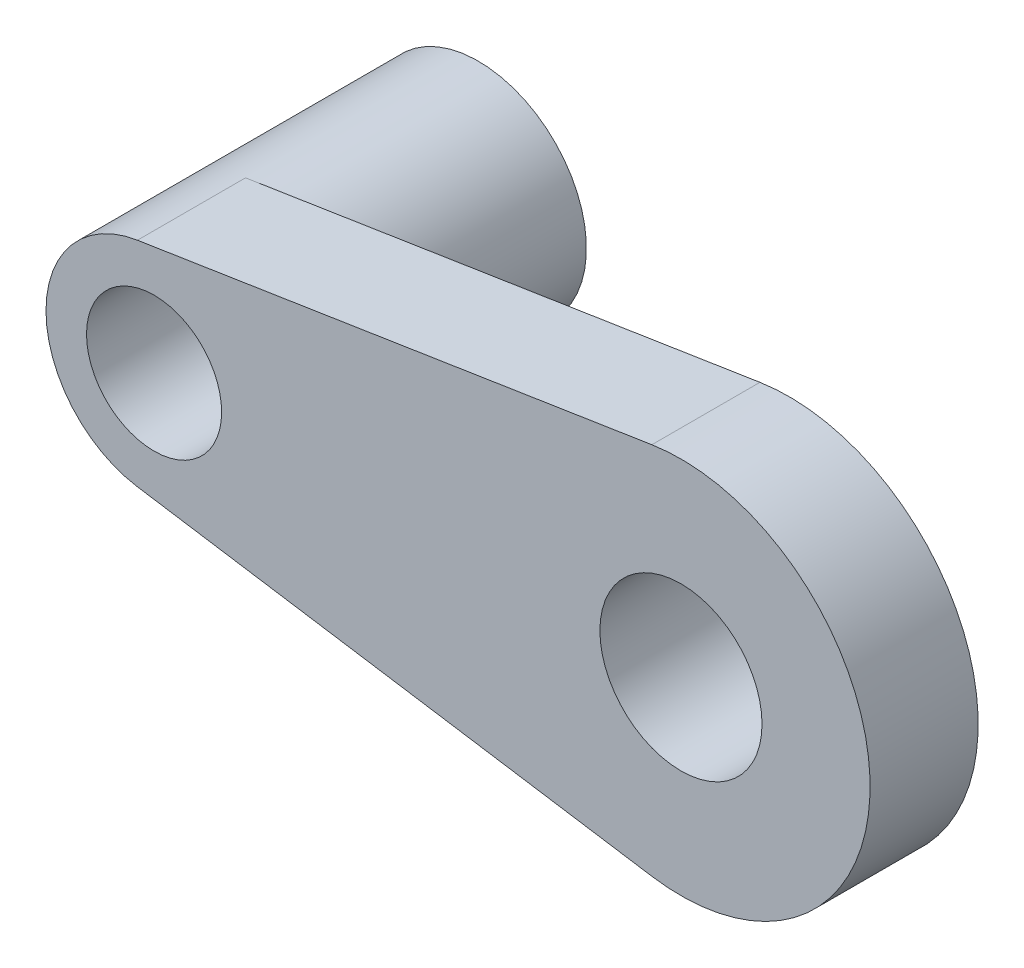
ISO-10303-21;
HEADER;
FILE_DESCRIPTION(('STEP AP214'),'2;1');
FILE_NAME('part.step','',(''),(''),'','','');
FILE_SCHEMA(('AUTOMOTIVE_DESIGN { 1 0 10303 214 1 1 1 1 }'));
ENDSEC;
DATA;
#1=APPLICATION_CONTEXT('core data for automotive mechanical design processes');
#2=APPLICATION_PROTOCOL_DEFINITION('international standard','automotive_design',2000,#1);
#3=PRODUCT_CONTEXT('',#1,'mechanical');
#4=PRODUCT('Part','Part','',(#3));
#5=PRODUCT_RELATED_PRODUCT_CATEGORY('part','',(#4));
#6=PRODUCT_DEFINITION_FORMATION('','',#4);
#7=PRODUCT_DEFINITION_CONTEXT('part definition',#1,'design');
#8=PRODUCT_DEFINITION('design','',#6,#7);
#9=PRODUCT_DEFINITION_SHAPE('','',#8);
#10=(LENGTH_UNIT() NAMED_UNIT(*) SI_UNIT(.MILLI.,.METRE.));
#11=(NAMED_UNIT(*) PLANE_ANGLE_UNIT() SI_UNIT($,.RADIAN.));
#12=(NAMED_UNIT(*) SI_UNIT($,.STERADIAN.) SOLID_ANGLE_UNIT());
#13=UNCERTAINTY_MEASURE_WITH_UNIT(LENGTH_MEASURE(1.E-05),#10,'distance_accuracy_value','');
#14=(GEOMETRIC_REPRESENTATION_CONTEXT(3) GLOBAL_UNCERTAINTY_ASSIGNED_CONTEXT((#13)) GLOBAL_UNIT_ASSIGNED_CONTEXT((#10,
#11,#12)) REPRESENTATION_CONTEXT('',''));
#15=CARTESIAN_POINT('',(0.,0.,0.));
#16=DIRECTION('',(0.,0.,1.));
#17=DIRECTION('',(1.,0.,0.));
#18=AXIS2_PLACEMENT_3D('',#15,#16,#17);
#19=CARTESIAN_POINT('',(-9.75,0.,0.));
#20=DIRECTION('',(0.,0.,1.));
#21=DIRECTION('',(1.,0.,0.));
#22=AXIS2_PLACEMENT_3D('',#19,#20,#21);
#23=PLANE('',#22);
#24=CARTESIAN_POINT('',(-9.75,0.,0.));
#25=DIRECTION('',(0.,0.,-1.));
#26=DIRECTION('',(-1.,0.,0.));
#27=AXIS2_PLACEMENT_3D('',#24,#25,#26);
#28=CIRCLE('',#27,2.);
#29=CARTESIAN_POINT('',(-10.0576923076923,1.97618962748694,0.));
#30=VERTEX_POINT('',#29);
#31=CARTESIAN_POINT('',(-10.0576923076923,-1.97618962748694,0.));
#32=VERTEX_POINT('',#31);
#33=EDGE_CURVE('E89',#30,#32,#28,.T.);
#34=ORIENTED_EDGE('',*,*,#33,.F.);
#35=DIRECTION('',(-0.988094813743471,-0.153846153846154,0.));
#36=VECTOR('',#35,1.);
#37=CARTESIAN_POINT('',(-10.0576923076923,1.97618962748694,0.));
#38=LINE('',#37,#36);
#39=CARTESIAN_POINT('',(-0.538461538461538,3.45833184810215,0.));
#40=VERTEX_POINT('',#39);
#41=EDGE_CURVE('E92',#40,#30,#38,.T.);
#42=ORIENTED_EDGE('',*,*,#41,.F.);
#43=CARTESIAN_POINT('',(0.,0.,0.));
#44=DIRECTION('',(0.,0.,1.));
#45=DIRECTION('',(1.,0.,0.));
#46=AXIS2_PLACEMENT_3D('',#43,#44,#45);
#47=CIRCLE('',#46,3.5);
#48=CARTESIAN_POINT('',(-0.538461538461539,-3.45833184810215,0.));
#49=VERTEX_POINT('',#48);
#50=EDGE_CURVE('E79',#49,#40,#47,.T.);
#51=ORIENTED_EDGE('',*,*,#50,.F.);
#52=DIRECTION('',(0.988094813743471,-0.153846153846154,0.));
#53=VECTOR('',#52,1.);
#54=CARTESIAN_POINT('',(-10.0576923076923,-1.97618962748694,0.));
#55=LINE('',#54,#53);
#56=EDGE_CURVE('E72',#32,#49,#55,.T.);
#57=ORIENTED_EDGE('',*,*,#56,.F.);
#58=EDGE_LOOP('',(#34,#42,#51,#57));
#59=FACE_BOUND('',#58,.T.);
#60=CARTESIAN_POINT('',(0.,0.,0.));
#61=DIRECTION('',(0.,0.,1.));
#62=DIRECTION('',(1.,0.,0.));
#63=AXIS2_PLACEMENT_3D('',#60,#61,#62);
#64=CIRCLE('',#63,1.75);
#65=CARTESIAN_POINT('',(1.75,0.,0.));
#66=VERTEX_POINT('',#65);
#67=EDGE_CURVE('E11',#66,#66,#64,.F.);
#68=ORIENTED_EDGE('',*,*,#67,.F.);
#69=EDGE_LOOP('',(#68));
#70=FACE_BOUND('',#69,.T.);
#71=ADVANCED_FACE('F39',(#59,#70),#23,.F.);
#72=CARTESIAN_POINT('',(-9.75,0.,2.));
#73=DIRECTION('',(0.,0.,1.));
#74=DIRECTION('',(1.,0.,0.));
#75=AXIS2_PLACEMENT_3D('',#72,#73,#74);
#76=PLANE('',#75);
#77=CARTESIAN_POINT('',(0.,0.,2.));
#78=DIRECTION('',(0.,0.,1.));
#79=DIRECTION('',(1.,0.,0.));
#80=AXIS2_PLACEMENT_3D('',#77,#78,#79);
#81=CIRCLE('',#80,1.5);
#82=CARTESIAN_POINT('',(1.5,0.,2.));
#83=VERTEX_POINT('',#82);
#84=EDGE_CURVE('E189',#83,#83,#81,.T.);
#85=ORIENTED_EDGE('',*,*,#84,.F.);
#86=EDGE_LOOP('',(#85));
#87=FACE_BOUND('',#86,.T.);
#88=CARTESIAN_POINT('',(-9.75,0.,2.));
#89=DIRECTION('',(0.,0.,1.));
#90=DIRECTION('',(1.,0.,0.));
#91=AXIS2_PLACEMENT_3D('',#88,#89,#90);
#92=CIRCLE('',#91,2.);
#93=CARTESIAN_POINT('',(-10.0576923076923,1.97618962748694,2.));
#94=VERTEX_POINT('',#93);
#95=CARTESIAN_POINT('',(-10.0576923076923,-1.97618962748694,2.));
#96=VERTEX_POINT('',#95);
#97=EDGE_CURVE('E106',#94,#96,#92,.T.);
#98=ORIENTED_EDGE('',*,*,#97,.T.);
#99=DIRECTION('',(0.988094813743471,-0.153846153846154,0.));
#100=VECTOR('',#99,1.);
#101=CARTESIAN_POINT('',(-10.0576923076923,-1.97618962748694,2.));
#102=LINE('',#101,#100);
#103=CARTESIAN_POINT('',(-0.538461538461539,-3.45833184810215,2.));
#104=VERTEX_POINT('',#103);
#105=EDGE_CURVE('E84',#96,#104,#102,.T.);
#106=ORIENTED_EDGE('',*,*,#105,.T.);
#107=CARTESIAN_POINT('',(0.,0.,2.));
#108=DIRECTION('',(0.,0.,1.));
#109=DIRECTION('',(1.,0.,0.));
#110=AXIS2_PLACEMENT_3D('',#107,#108,#109);
#111=CIRCLE('',#110,3.5);
#112=CARTESIAN_POINT('',(-0.538461538461538,3.45833184810215,2.));
#113=VERTEX_POINT('',#112);
#114=EDGE_CURVE('E115',#104,#113,#111,.T.);
#115=ORIENTED_EDGE('',*,*,#114,.T.);
#116=DIRECTION('',(-0.988094813743471,-0.153846153846154,0.));
#117=VECTOR('',#116,1.);
#118=CARTESIAN_POINT('',(-10.0576923076923,1.97618962748694,2.));
#119=LINE('',#118,#117);
#120=EDGE_CURVE('E57',#113,#94,#119,.T.);
#121=ORIENTED_EDGE('',*,*,#120,.T.);
#122=EDGE_LOOP('',(#98,#106,#115,#121));
#123=FACE_BOUND('',#122,.T.);
#124=CARTESIAN_POINT('',(-9.75,0.,2.));
#125=DIRECTION('',(0.,0.,1.));
#126=DIRECTION('',(1.,0.,0.));
#127=AXIS2_PLACEMENT_3D('',#124,#125,#126);
#128=CIRCLE('',#127,1.25);
#129=CARTESIAN_POINT('',(-8.5,0.,2.));
#130=VERTEX_POINT('',#129);
#131=EDGE_CURVE('E184',#130,#130,#128,.T.);
#132=ORIENTED_EDGE('',*,*,#131,.F.);
#133=EDGE_LOOP('',(#132));
#134=FACE_BOUND('',#133,.T.);
#135=ADVANCED_FACE('F129',(#87,#123,#134),#76,.T.);
#136=CARTESIAN_POINT('',(-9.75,0.,2.));
#137=DIRECTION('',(0.,0.,-1.));
#138=DIRECTION('',(-1.,0.,0.));
#139=AXIS2_PLACEMENT_3D('',#136,#137,#138);
#140=CYLINDRICAL_SURFACE('',#139,2.);
#141=DIRECTION('',(0.,0.,-1.));
#142=VECTOR('',#141,1.);
#143=CARTESIAN_POINT('',(-10.0576923076923,1.97618962748694,2.));
#144=LINE('',#143,#142);
#145=EDGE_CURVE('E102',#94,#30,#144,.T.);
#146=ORIENTED_EDGE('',*,*,#145,.T.);
#147=ORIENTED_EDGE('',*,*,#33,.T.);
#148=DIRECTION('',(0.,0.,-1.));
#149=VECTOR('',#148,1.);
#150=CARTESIAN_POINT('',(-10.0576923076923,-1.97618962748694,2.));
#151=LINE('',#150,#149);
#152=EDGE_CURVE('E49',#96,#32,#151,.T.);
#153=ORIENTED_EDGE('',*,*,#152,.F.);
#154=ORIENTED_EDGE('',*,*,#97,.F.);
#155=EDGE_LOOP('',(#146,#147,#153,#154));
#156=FACE_BOUND('',#155,.T.);
#157=CARTESIAN_POINT('',(-9.75,0.,-4.));
#158=DIRECTION('',(0.,0.,-1.));
#159=DIRECTION('',(-1.,0.,0.));
#160=AXIS2_PLACEMENT_3D('',#157,#158,#159);
#161=CIRCLE('',#160,2.);
#162=CARTESIAN_POINT('',(-11.75,0.,-4.));
#163=VERTEX_POINT('',#162);
#164=EDGE_CURVE('E97',#163,#163,#161,.T.);
#165=ORIENTED_EDGE('',*,*,#164,.F.);
#166=EDGE_LOOP('',(#165));
#167=FACE_BOUND('',#166,.T.);
#168=ADVANCED_FACE('F41',(#156,#167),#140,.T.);
#169=CARTESIAN_POINT('',(-10.0576923076923,-1.97618962748694,2.));
#170=DIRECTION('',(0.153846153846154,0.988094813743472,0.));
#171=DIRECTION('',(-0.988094813743471,0.153846153846154,0.));
#172=AXIS2_PLACEMENT_3D('',#169,#170,#171);
#173=PLANE('',#172);
#174=ORIENTED_EDGE('',*,*,#56,.T.);
#175=DIRECTION('',(0.,0.,-1.));
#176=VECTOR('',#175,1.);
#177=CARTESIAN_POINT('',(-0.538461538461539,-3.45833184810215,2.));
#178=LINE('',#177,#176);
#179=EDGE_CURVE('E113',#104,#49,#178,.T.);
#180=ORIENTED_EDGE('',*,*,#179,.F.);
#181=ORIENTED_EDGE('',*,*,#105,.F.);
#182=ORIENTED_EDGE('',*,*,#152,.T.);
#183=EDGE_LOOP('',(#174,#180,#181,#182));
#184=FACE_BOUND('',#183,.T.);
#185=ADVANCED_FACE('F121',(#184),#173,.F.);
#186=CARTESIAN_POINT('',(0.,0.,2.));
#187=DIRECTION('',(0.,0.,-1.));
#188=DIRECTION('',(-1.,0.,0.));
#189=AXIS2_PLACEMENT_3D('',#186,#187,#188);
#190=CYLINDRICAL_SURFACE('',#189,3.5);
#191=ORIENTED_EDGE('',*,*,#50,.T.);
#192=DIRECTION('',(0.,0.,-1.));
#193=VECTOR('',#192,1.);
#194=CARTESIAN_POINT('',(-0.538461538461538,3.45833184810215,2.));
#195=LINE('',#194,#193);
#196=EDGE_CURVE('E104',#113,#40,#195,.T.);
#197=ORIENTED_EDGE('',*,*,#196,.F.);
#198=ORIENTED_EDGE('',*,*,#114,.F.);
#199=ORIENTED_EDGE('',*,*,#179,.T.);
#200=EDGE_LOOP('',(#191,#197,#198,#199));
#201=FACE_BOUND('',#200,.T.);
#202=ADVANCED_FACE('F123',(#201),#190,.T.);
#203=CARTESIAN_POINT('',(-10.0576923076923,1.97618962748694,2.));
#204=DIRECTION('',(0.153846153846154,-0.988094813743472,0.));
#205=DIRECTION('',(0.988094813743471,0.153846153846154,0.));
#206=AXIS2_PLACEMENT_3D('',#203,#204,#205);
#207=PLANE('',#206);
#208=ORIENTED_EDGE('',*,*,#41,.T.);
#209=ORIENTED_EDGE('',*,*,#145,.F.);
#210=ORIENTED_EDGE('',*,*,#120,.F.);
#211=ORIENTED_EDGE('',*,*,#196,.T.);
#212=EDGE_LOOP('',(#208,#209,#210,#211));
#213=FACE_BOUND('',#212,.T.);
#214=ADVANCED_FACE('F101',(#213),#207,.F.);
#215=CARTESIAN_POINT('',(0.,0.,2.));
#216=DIRECTION('',(0.,0.,-1.));
#217=DIRECTION('',(-1.,0.,0.));
#218=AXIS2_PLACEMENT_3D('',#215,#216,#217);
#219=CYLINDRICAL_SURFACE('',#218,1.5);
#220=ORIENTED_EDGE('',*,*,#84,.T.);
#221=EDGE_LOOP('',(#220));
#222=FACE_BOUND('',#221,.T.);
#223=CARTESIAN_POINT('',(0.,0.,-0.5));
#224=DIRECTION('',(0.,0.,-1.));
#225=DIRECTION('',(-1.,0.,0.));
#226=AXIS2_PLACEMENT_3D('',#223,#224,#225);
#227=CIRCLE('',#226,1.5);
#228=CARTESIAN_POINT('',(-1.5,0.,-0.5));
#229=VERTEX_POINT('',#228);
#230=EDGE_CURVE('E173',#229,#229,#227,.T.);
#231=ORIENTED_EDGE('',*,*,#230,.T.);
#232=EDGE_LOOP('',(#231));
#233=FACE_BOUND('',#232,.T.);
#234=ADVANCED_FACE('F140',(#222,#233),#219,.F.);
#235=CARTESIAN_POINT('',(-9.75,0.,2.));
#236=DIRECTION('',(0.,0.,-1.));
#237=DIRECTION('',(-1.,0.,0.));
#238=AXIS2_PLACEMENT_3D('',#235,#236,#237);
#239=CYLINDRICAL_SURFACE('',#238,1.25);
#240=ORIENTED_EDGE('',*,*,#131,.T.);
#241=EDGE_LOOP('',(#240));
#242=FACE_BOUND('',#241,.T.);
#243=CARTESIAN_POINT('',(-9.75,0.,-4.));
#244=DIRECTION('',(0.,0.,-1.));
#245=DIRECTION('',(-1.,0.,0.));
#246=AXIS2_PLACEMENT_3D('',#243,#244,#245);
#247=CIRCLE('',#246,1.25);
#248=CARTESIAN_POINT('',(-11.,0.,-4.));
#249=VERTEX_POINT('',#248);
#250=EDGE_CURVE('E98',#249,#249,#247,.T.);
#251=ORIENTED_EDGE('',*,*,#250,.T.);
#252=EDGE_LOOP('',(#251));
#253=FACE_BOUND('',#252,.T.);
#254=ADVANCED_FACE('F144',(#242,#253),#239,.F.);
#255=CARTESIAN_POINT('',(-9.75,0.,-4.));
#256=DIRECTION('',(0.,0.,-1.));
#257=DIRECTION('',(-1.,0.,0.));
#258=AXIS2_PLACEMENT_3D('',#255,#256,#257);
#259=PLANE('',#258);
#260=ORIENTED_EDGE('',*,*,#164,.T.);
#261=EDGE_LOOP('',(#260));
#262=FACE_BOUND('',#261,.T.);
#263=ORIENTED_EDGE('',*,*,#250,.F.);
#264=EDGE_LOOP('',(#263));
#265=FACE_BOUND('',#264,.T.);
#266=ADVANCED_FACE('F149',(#262,#265),#259,.T.);
#267=CARTESIAN_POINT('',(0.,0.,-0.5));
#268=DIRECTION('',(0.,0.,-1.));
#269=DIRECTION('',(-1.,0.,0.));
#270=AXIS2_PLACEMENT_3D('',#267,#268,#269);
#271=PLANE('',#270);
#272=CARTESIAN_POINT('',(0.,0.,-0.5));
#273=DIRECTION('',(0.,0.,-1.));
#274=DIRECTION('',(-1.,0.,0.));
#275=AXIS2_PLACEMENT_3D('',#272,#273,#274);
#276=CIRCLE('',#275,1.75);
#277=CARTESIAN_POINT('',(-1.75,0.,-0.5));
#278=VERTEX_POINT('',#277);
#279=EDGE_CURVE('E170',#278,#278,#276,.T.);
#280=ORIENTED_EDGE('',*,*,#279,.T.);
#281=EDGE_LOOP('',(#280));
#282=FACE_BOUND('',#281,.T.);
#283=ORIENTED_EDGE('',*,*,#230,.F.);
#284=EDGE_LOOP('',(#283));
#285=FACE_BOUND('',#284,.T.);
#286=ADVANCED_FACE('F157',(#282,#285),#271,.T.);
#287=CARTESIAN_POINT('',(0.,0.,-0.5));
#288=DIRECTION('',(0.,0.,1.));
#289=DIRECTION('',(1.,0.,0.));
#290=AXIS2_PLACEMENT_3D('',#287,#288,#289);
#291=CYLINDRICAL_SURFACE('',#290,1.75);
#292=ORIENTED_EDGE('',*,*,#279,.F.);
#293=EDGE_LOOP('',(#292));
#294=FACE_BOUND('',#293,.T.);
#295=ORIENTED_EDGE('',*,*,#67,.T.);
#296=EDGE_LOOP('',(#295));
#297=FACE_BOUND('',#296,.T.);
#298=ADVANCED_FACE('F159',(#294,#297),#291,.T.);
#299=CLOSED_SHELL('',(#71,#135,#168,#185,#202,#214,#234,#254,#266,#286,#298));
#300=MANIFOLD_SOLID_BREP('B2',#299);
#301=ADVANCED_BREP_SHAPE_REPRESENTATION('',(#18,#300),#14);
#302=SHAPE_DEFINITION_REPRESENTATION(#9,#301);
ENDSEC;
END-ISO-10303-21;
